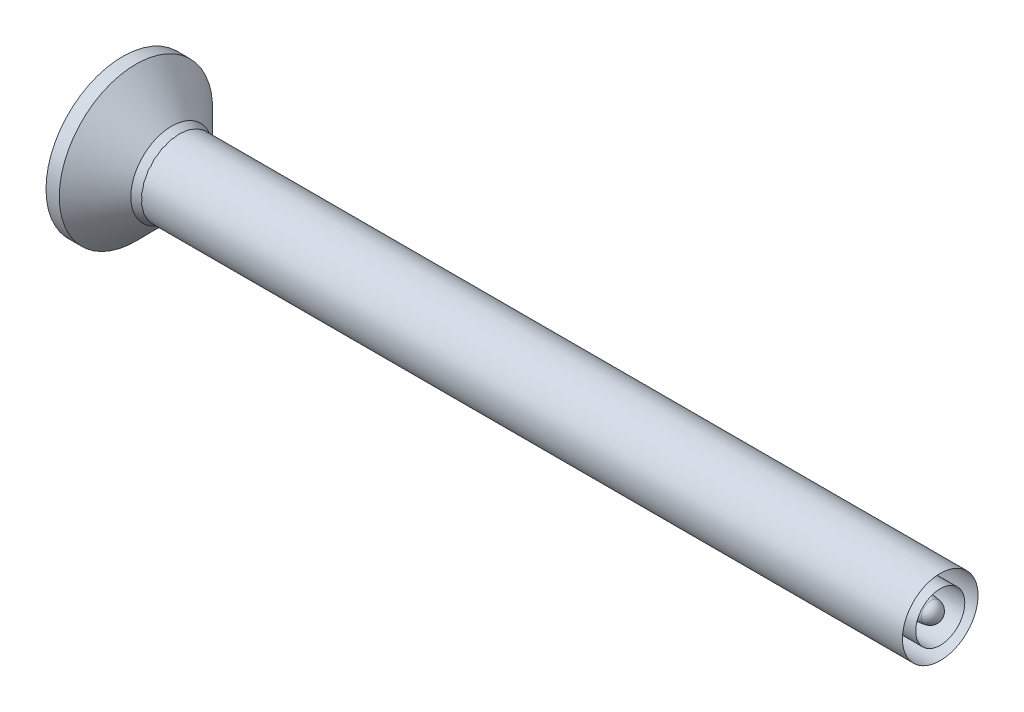
ISO-10303-21;
HEADER;
FILE_DESCRIPTION(('STEP AP214'),'2;1');
FILE_NAME('part.step','',(''),(''),'','','');
FILE_SCHEMA(('AUTOMOTIVE_DESIGN { 1 0 10303 214 1 1 1 1 }'));
ENDSEC;
DATA;
#1=APPLICATION_CONTEXT('core data for automotive mechanical design processes');
#2=APPLICATION_PROTOCOL_DEFINITION('international standard','automotive_design',2000,#1);
#3=PRODUCT_CONTEXT('',#1,'mechanical');
#4=PRODUCT('Part','Part','',(#3));
#5=PRODUCT_RELATED_PRODUCT_CATEGORY('part','',(#4));
#6=PRODUCT_DEFINITION_FORMATION('','',#4);
#7=PRODUCT_DEFINITION_CONTEXT('part definition',#1,'design');
#8=PRODUCT_DEFINITION('design','',#6,#7);
#9=PRODUCT_DEFINITION_SHAPE('','',#8);
#10=(LENGTH_UNIT() NAMED_UNIT(*) SI_UNIT(.MILLI.,.METRE.));
#11=(NAMED_UNIT(*) PLANE_ANGLE_UNIT() SI_UNIT($,.RADIAN.));
#12=(NAMED_UNIT(*) SI_UNIT($,.STERADIAN.) SOLID_ANGLE_UNIT());
#13=UNCERTAINTY_MEASURE_WITH_UNIT(LENGTH_MEASURE(1.E-05),#10,'distance_accuracy_value','');
#14=(GEOMETRIC_REPRESENTATION_CONTEXT(3) GLOBAL_UNCERTAINTY_ASSIGNED_CONTEXT((#13)) GLOBAL_UNIT_ASSIGNED_CONTEXT((#10,
#11,#12)) REPRESENTATION_CONTEXT('',''));
#15=CARTESIAN_POINT('',(0.,0.,0.));
#16=DIRECTION('',(0.,0.,1.));
#17=DIRECTION('',(1.,0.,0.));
#18=AXIS2_PLACEMENT_3D('',#15,#16,#17);
#19=CARTESIAN_POINT('',(0.,0.,0.));
#20=DIRECTION('',(1.,0.,0.));
#21=DIRECTION('',(0.,0.,-1.));
#22=AXIS2_PLACEMENT_3D('',#19,#20,#21);
#23=CYLINDRICAL_SURFACE('',#22,2.3495);
#24=CARTESIAN_POINT('',(0.,0.,0.));
#25=DIRECTION('',(-1.,0.,0.));
#26=DIRECTION('',(0.,0.,1.));
#27=AXIS2_PLACEMENT_3D('',#24,#25,#26);
#28=CIRCLE('',#27,2.3495);
#29=CARTESIAN_POINT('',(0.,0.,2.3495));
#30=VERTEX_POINT('',#29);
#31=EDGE_CURVE('E62',#30,#30,#28,.T.);
#32=ORIENTED_EDGE('',*,*,#31,.T.);
#33=EDGE_LOOP('',(#32));
#34=FACE_BOUND('',#33,.T.);
#35=CARTESIAN_POINT('',(50.8,0.,0.));
#36=DIRECTION('',(-1.,0.,0.));
#37=DIRECTION('',(0.,0.,1.));
#38=AXIS2_PLACEMENT_3D('',#35,#36,#37);
#39=CIRCLE('',#38,2.3495);
#40=CARTESIAN_POINT('',(50.8,0.,2.3495));
#41=VERTEX_POINT('',#40);
#42=EDGE_CURVE('E11',#41,#41,#39,.T.);
#43=ORIENTED_EDGE('',*,*,#42,.F.);
#44=EDGE_LOOP('',(#43));
#45=FACE_BOUND('',#44,.T.);
#46=ADVANCED_FACE('F58',(#34,#45),#23,.F.);
#47=OPEN_SHELL('',(#46));
#48=SHELL_BASED_SURFACE_MODEL('B2',(#47));
#49=CARTESIAN_POINT('',(0.,0.,0.));
#50=DIRECTION('',(1.,0.,0.));
#51=DIRECTION('',(0.,0.,-1.));
#52=AXIS2_PLACEMENT_3D('',#49,#50,#51);
#53=CYLINDRICAL_SURFACE('',#52,1.524);
#54=CARTESIAN_POINT('',(0.,0.,0.));
#55=DIRECTION('',(1.,0.,0.));
#56=DIRECTION('',(0.,0.,-1.));
#57=AXIS2_PLACEMENT_3D('',#54,#55,#56);
#58=CIRCLE('',#57,1.524);
#59=CARTESIAN_POINT('',(0.,0.,-1.524));
#60=VERTEX_POINT('',#59);
#61=EDGE_CURVE('E96',#60,#60,#58,.T.);
#62=ORIENTED_EDGE('',*,*,#61,.T.);
#63=EDGE_LOOP('',(#62));
#64=FACE_BOUND('',#63,.T.);
#65=CARTESIAN_POINT('',(50.8,0.,0.));
#66=DIRECTION('',(1.,0.,0.));
#67=DIRECTION('',(0.,0.,-1.));
#68=AXIS2_PLACEMENT_3D('',#65,#66,#67);
#69=CIRCLE('',#68,1.524);
#70=CARTESIAN_POINT('',(50.8,0.,-1.524));
#71=VERTEX_POINT('',#70);
#72=EDGE_CURVE('E57',#71,#71,#69,.T.);
#73=ORIENTED_EDGE('',*,*,#72,.F.);
#74=EDGE_LOOP('',(#73));
#75=FACE_BOUND('',#74,.T.);
#76=ADVANCED_FACE('F92',(#64,#75),#53,.T.);
#77=OPEN_SHELL('',(#76));
#78=SHELL_BASED_SURFACE_MODEL('B6',(#77));
#79=CARTESIAN_POINT('',(0.,0.,0.));
#80=DIRECTION('',(-1.,0.,0.));
#81=DIRECTION('',(0.,0.,1.));
#82=AXIS2_PLACEMENT_3D('',#79,#80,#81);
#83=CYLINDRICAL_SURFACE('',#82,4.7625);
#84=CARTESIAN_POINT('',(0.825500000000002,0.,0.));
#85=DIRECTION('',(-1.,0.,0.));
#86=DIRECTION('',(0.,0.,1.));
#87=AXIS2_PLACEMENT_3D('',#84,#85,#86);
#88=CIRCLE('',#87,4.7625);
#89=CARTESIAN_POINT('',(0.825500000000002,0.,4.7625));
#90=VERTEX_POINT('',#89);
#91=EDGE_CURVE('E154',#90,#90,#88,.T.);
#92=ORIENTED_EDGE('',*,*,#91,.T.);
#93=EDGE_LOOP('',(#92));
#94=FACE_BOUND('',#93,.T.);
#95=CARTESIAN_POINT('',(0.,0.,0.));
#96=DIRECTION('',(-1.,0.,0.));
#97=DIRECTION('',(0.,0.,1.));
#98=AXIS2_PLACEMENT_3D('',#95,#96,#97);
#99=CIRCLE('',#98,4.7625);
#100=CARTESIAN_POINT('',(0.,0.,4.7625));
#101=VERTEX_POINT('',#100);
#102=EDGE_CURVE('E91',#101,#101,#99,.T.);
#103=ORIENTED_EDGE('',*,*,#102,.F.);
#104=EDGE_LOOP('',(#103));
#105=FACE_BOUND('',#104,.T.);
#106=ADVANCED_FACE('F119',(#94,#105),#83,.T.);
#107=CARTESIAN_POINT('',(0.,-4.7625,0.));
#108=DIRECTION('',(-1.,0.,0.));
#109=DIRECTION('',(0.,0.,1.));
#110=AXIS2_PLACEMENT_3D('',#107,#108,#109);
#111=PLANE('',#110);
#112=ORIENTED_EDGE('',*,*,#102,.T.);
#113=EDGE_LOOP('',(#112));
#114=FACE_BOUND('',#113,.T.);
#115=ADVANCED_FACE('F173',(#114),#111,.T.);
#116=CARTESIAN_POINT('',(50.165,0.,0.));
#117=DIRECTION('',(-1.,0.,0.));
#118=DIRECTION('',(0.,-1.,0.));
#119=AXIS2_PLACEMENT_3D('',#116,#117,#118);
#120=SPHERICAL_SURFACE('',#119,0.634999999999998);
#121=CARTESIAN_POINT('',(50.2478841320597,0.,0.));
#122=DIRECTION('',(-1.,0.,0.));
#123=DIRECTION('',(0.,0.,1.));
#124=AXIS2_PLACEMENT_3D('',#121,#122,#123);
#125=CIRCLE('',#124,0.629567486972368);
#126=CARTESIAN_POINT('',(50.2478841320597,0.,0.629567486972368));
#127=VERTEX_POINT('',#126);
#128=EDGE_CURVE('E126',#127,#127,#125,.T.);
#129=ORIENTED_EDGE('',*,*,#128,.F.);
#130=EDGE_LOOP('',(#129));
#131=FACE_BOUND('',#130,.T.);
#132=ADVANCED_FACE('F177',(#131),#120,.T.);
#133=CARTESIAN_POINT('',(43.4539946926749,0.,0.));
#134=DIRECTION('',(-1.,0.,0.));
#135=DIRECTION('',(0.,0.,1.));
#136=AXIS2_PLACEMENT_3D('',#133,#134,#135);
#137=CONICAL_SURFACE('',#136,1.524,0.130899693899572);
#138=ORIENTED_EDGE('',*,*,#128,.T.);
#139=EDGE_LOOP('',(#138));
#140=FACE_BOUND('',#139,.T.);
#141=CARTESIAN_POINT('',(43.4539946926749,0.,0.));
#142=DIRECTION('',(-1.,0.,0.));
#143=DIRECTION('',(0.,0.,1.));
#144=AXIS2_PLACEMENT_3D('',#141,#142,#143);
#145=CIRCLE('',#144,1.524);
#146=CARTESIAN_POINT('',(43.4539946926749,0.,1.524));
#147=VERTEX_POINT('',#146);
#148=EDGE_CURVE('E131',#147,#147,#145,.T.);
#149=ORIENTED_EDGE('',*,*,#148,.F.);
#150=EDGE_LOOP('',(#149));
#151=FACE_BOUND('',#150,.T.);
#152=ADVANCED_FACE('F181',(#140,#151),#137,.T.);
#153=CARTESIAN_POINT('',(0.,0.,0.));
#154=DIRECTION('',(-1.,0.,0.));
#155=DIRECTION('',(0.,0.,1.));
#156=AXIS2_PLACEMENT_3D('',#153,#154,#155);
#157=CYLINDRICAL_SURFACE('',#156,1.524);
#158=ORIENTED_EDGE('',*,*,#148,.T.);
#159=EDGE_LOOP('',(#158));
#160=FACE_BOUND('',#159,.T.);
#161=CARTESIAN_POINT('',(29.6281563515532,0.,0.));
#162=DIRECTION('',(-1.,0.,0.));
#163=DIRECTION('',(0.,0.,1.));
#164=AXIS2_PLACEMENT_3D('',#161,#162,#163);
#165=CIRCLE('',#164,1.524);
#166=CARTESIAN_POINT('',(29.6281563515532,0.,1.524));
#167=VERTEX_POINT('',#166);
#168=EDGE_CURVE('E136',#167,#167,#165,.T.);
#169=ORIENTED_EDGE('',*,*,#168,.F.);
#170=EDGE_LOOP('',(#169));
#171=FACE_BOUND('',#170,.T.);
#172=ADVANCED_FACE('F187',(#160,#171),#157,.T.);
#173=CARTESIAN_POINT('',(27.94,0.,0.));
#174=DIRECTION('',(-1.,0.,0.));
#175=DIRECTION('',(0.,0.,1.));
#176=AXIS2_PLACEMENT_3D('',#173,#174,#175);
#177=CONICAL_SURFACE('',#176,1.74625,0.130899693899576);
#178=ORIENTED_EDGE('',*,*,#168,.T.);
#179=EDGE_LOOP('',(#178));
#180=FACE_BOUND('',#179,.T.);
#181=CARTESIAN_POINT('',(27.94,0.,0.));
#182=DIRECTION('',(-1.,0.,0.));
#183=DIRECTION('',(0.,0.,1.));
#184=AXIS2_PLACEMENT_3D('',#181,#182,#183);
#185=CIRCLE('',#184,1.74625);
#186=CARTESIAN_POINT('',(27.94,0.,1.74625));
#187=VERTEX_POINT('',#186);
#188=EDGE_CURVE('E142',#187,#187,#185,.T.);
#189=ORIENTED_EDGE('',*,*,#188,.F.);
#190=EDGE_LOOP('',(#189));
#191=FACE_BOUND('',#190,.T.);
#192=ADVANCED_FACE('F190',(#180,#191),#177,.T.);
#193=CARTESIAN_POINT('',(0.,0.,0.));
#194=DIRECTION('',(-1.,0.,0.));
#195=DIRECTION('',(0.,0.,1.));
#196=AXIS2_PLACEMENT_3D('',#193,#194,#195);
#197=CYLINDRICAL_SURFACE('',#196,1.74625);
#198=ORIENTED_EDGE('',*,*,#188,.T.);
#199=EDGE_LOOP('',(#198));
#200=FACE_BOUND('',#199,.T.);
#201=CARTESIAN_POINT('',(5.08,0.,0.));
#202=DIRECTION('',(-1.,0.,0.));
#203=DIRECTION('',(0.,0.,1.));
#204=AXIS2_PLACEMENT_3D('',#201,#202,#203);
#205=CIRCLE('',#204,1.74625);
#206=CARTESIAN_POINT('',(5.08,0.,1.74625));
#207=VERTEX_POINT('',#206);
#208=EDGE_CURVE('E146',#207,#207,#205,.T.);
#209=ORIENTED_EDGE('',*,*,#208,.F.);
#210=EDGE_LOOP('',(#209));
#211=FACE_BOUND('',#210,.T.);
#212=ADVANCED_FACE('F169',(#200,#211),#197,.T.);
#213=CARTESIAN_POINT('',(3.048,0.,0.));
#214=DIRECTION('',(-1.,0.,0.));
#215=DIRECTION('',(0.,0.,1.));
#216=AXIS2_PLACEMENT_3D('',#213,#214,#215);
#217=CONICAL_SURFACE('',#216,2.54,0.372398446676753);
#218=ORIENTED_EDGE('',*,*,#208,.T.);
#219=EDGE_LOOP('',(#218));
#220=FACE_BOUND('',#219,.T.);
#221=CARTESIAN_POINT('',(3.048,0.,0.));
#222=DIRECTION('',(-1.,0.,0.));
#223=DIRECTION('',(0.,0.,1.));
#224=AXIS2_PLACEMENT_3D('',#221,#222,#223);
#225=CIRCLE('',#224,2.54);
#226=CARTESIAN_POINT('',(3.048,0.,2.54));
#227=VERTEX_POINT('',#226);
#228=EDGE_CURVE('E150',#227,#227,#225,.T.);
#229=ORIENTED_EDGE('',*,*,#228,.F.);
#230=EDGE_LOOP('',(#229));
#231=FACE_BOUND('',#230,.T.);
#232=ADVANCED_FACE('F163',(#220,#231),#217,.T.);
#233=CARTESIAN_POINT('',(0.825500000000002,0.,0.));
#234=DIRECTION('',(-1.,0.,0.));
#235=DIRECTION('',(0.,0.,1.));
#236=AXIS2_PLACEMENT_3D('',#233,#234,#235);
#237=CONICAL_SURFACE('',#236,4.7625,0.785398163397449);
#238=ORIENTED_EDGE('',*,*,#228,.T.);
#239=EDGE_LOOP('',(#238));
#240=FACE_BOUND('',#239,.T.);
#241=ORIENTED_EDGE('',*,*,#91,.F.);
#242=EDGE_LOOP('',(#241));
#243=FACE_BOUND('',#242,.T.);
#244=ADVANCED_FACE('F161',(#240,#243),#237,.T.);
#245=CLOSED_SHELL('',(#106,#115,#132,#152,#172,#192,#212,#232,#244));
#246=MANIFOLD_SOLID_BREP('B52',#245);
#247=ADVANCED_BREP_SHAPE_REPRESENTATION('',(#18,#246),#14);
#248=MANIFOLD_SURFACE_SHAPE_REPRESENTATION('',(#18,#48,#78),#14);
#249=SHAPE_REPRESENTATION('',(#18),#14);
#250=SHAPE_DEFINITION_REPRESENTATION(#9,#249);
#251=SHAPE_REPRESENTATION_RELATIONSHIP('','',#249,#247);
#252=SHAPE_REPRESENTATION_RELATIONSHIP('','',#249,#248);
ENDSEC;
END-ISO-10303-21;
